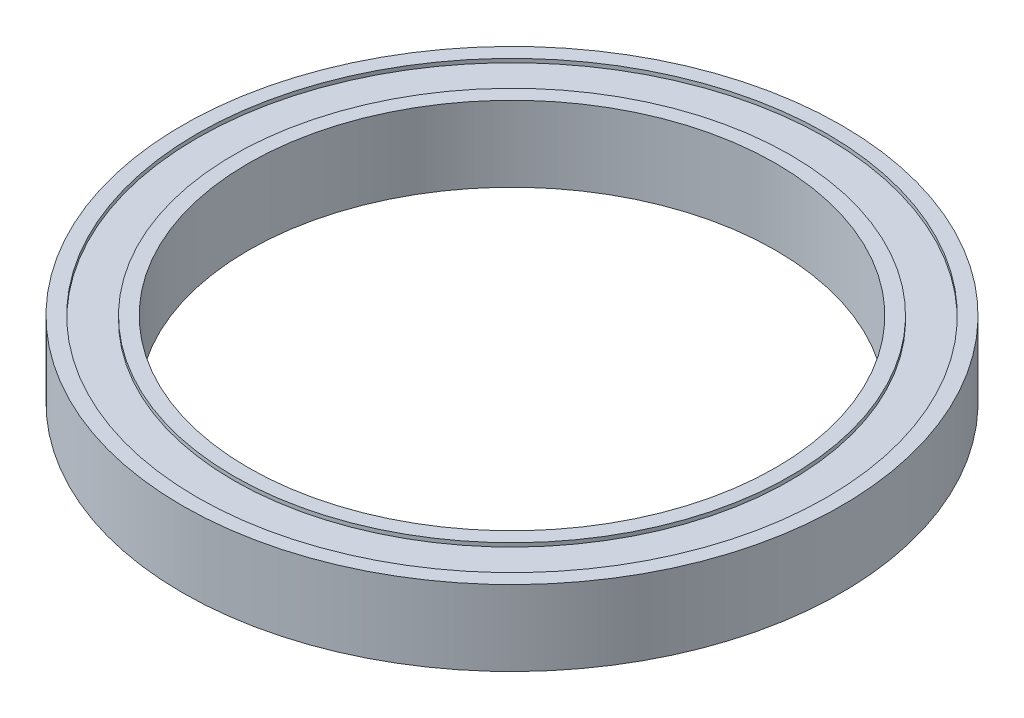
ISO-10303-21;
HEADER;
FILE_DESCRIPTION(('STEP AP214'),'2;1');
FILE_NAME('part.step','',(''),(''),'','','');
FILE_SCHEMA(('AUTOMOTIVE_DESIGN { 1 0 10303 214 1 1 1 1 }'));
ENDSEC;
DATA;
#1=APPLICATION_CONTEXT('core data for automotive mechanical design processes');
#2=APPLICATION_PROTOCOL_DEFINITION('international standard','automotive_design',2000,#1);
#3=PRODUCT_CONTEXT('',#1,'mechanical');
#4=PRODUCT('Part','Part','',(#3));
#5=PRODUCT_RELATED_PRODUCT_CATEGORY('part','',(#4));
#6=PRODUCT_DEFINITION_FORMATION('','',#4);
#7=PRODUCT_DEFINITION_CONTEXT('part definition',#1,'design');
#8=PRODUCT_DEFINITION('design','',#6,#7);
#9=PRODUCT_DEFINITION_SHAPE('','',#8);
#10=(LENGTH_UNIT() NAMED_UNIT(*) SI_UNIT(.MILLI.,.METRE.));
#11=(NAMED_UNIT(*) PLANE_ANGLE_UNIT() SI_UNIT($,.RADIAN.));
#12=(NAMED_UNIT(*) SI_UNIT($,.STERADIAN.) SOLID_ANGLE_UNIT());
#13=UNCERTAINTY_MEASURE_WITH_UNIT(LENGTH_MEASURE(1.E-05),#10,'distance_accuracy_value','');
#14=(GEOMETRIC_REPRESENTATION_CONTEXT(3) GLOBAL_UNCERTAINTY_ASSIGNED_CONTEXT((#13)) GLOBAL_UNIT_ASSIGNED_CONTEXT((#10,
#11,#12)) REPRESENTATION_CONTEXT('',''));
#15=CARTESIAN_POINT('',(0.,0.,0.));
#16=DIRECTION('',(0.,0.,1.));
#17=DIRECTION('',(1.,0.,0.));
#18=AXIS2_PLACEMENT_3D('',#15,#16,#17);
#19=CARTESIAN_POINT('',(14.,2.,0.));
#20=DIRECTION('',(0.,1.,0.));
#21=DIRECTION('',(0.,0.,1.));
#22=AXIS2_PLACEMENT_3D('',#19,#20,#21);
#23=PLANE('',#22);
#24=CARTESIAN_POINT('',(0.,2.,0.));
#25=DIRECTION('',(0.,-1.,0.));
#26=DIRECTION('',(0.,0.,-1.));
#27=AXIS2_PLACEMENT_3D('',#24,#25,#26);
#28=CIRCLE('',#27,14.);
#29=CARTESIAN_POINT('',(0.,2.,-14.));
#30=VERTEX_POINT('',#29);
#31=EDGE_CURVE('E81',#30,#30,#28,.T.);
#32=ORIENTED_EDGE('',*,*,#31,.T.);
#33=EDGE_LOOP('',(#32));
#34=FACE_BOUND('',#33,.T.);
#35=CARTESIAN_POINT('',(0.,2.,0.));
#36=DIRECTION('',(0.,-1.,0.));
#37=DIRECTION('',(0.,0.,-1.));
#38=AXIS2_PLACEMENT_3D('',#35,#36,#37);
#39=CIRCLE('',#38,14.7777777777778);
#40=CARTESIAN_POINT('',(0.,2.,-14.7777777777778));
#41=VERTEX_POINT('',#40);
#42=EDGE_CURVE('E10',#41,#41,#39,.T.);
#43=ORIENTED_EDGE('',*,*,#42,.F.);
#44=EDGE_LOOP('',(#43));
#45=FACE_BOUND('',#44,.T.);
#46=ADVANCED_FACE('F42',(#34,#45),#23,.T.);
#47=CARTESIAN_POINT('',(0.,0.,0.));
#48=DIRECTION('',(0.,-1.,0.));
#49=DIRECTION('',(0.,0.,-1.));
#50=AXIS2_PLACEMENT_3D('',#47,#48,#49);
#51=CYLINDRICAL_SURFACE('',#50,14.7777777777778);
#52=ORIENTED_EDGE('',*,*,#42,.T.);
#53=EDGE_LOOP('',(#52));
#54=FACE_BOUND('',#53,.T.);
#55=CARTESIAN_POINT('',(0.,1.8,0.));
#56=DIRECTION('',(0.,-1.,0.));
#57=DIRECTION('',(0.,0.,-1.));
#58=AXIS2_PLACEMENT_3D('',#55,#56,#57);
#59=CIRCLE('',#58,14.7777777777778);
#60=CARTESIAN_POINT('',(0.,1.8,-14.7777777777778));
#61=VERTEX_POINT('',#60);
#62=EDGE_CURVE('E49',#61,#61,#59,.T.);
#63=ORIENTED_EDGE('',*,*,#62,.F.);
#64=EDGE_LOOP('',(#63));
#65=FACE_BOUND('',#64,.T.);
#66=ADVANCED_FACE('F105',(#54,#65),#51,.T.);
#67=CARTESIAN_POINT('',(14.7777777777778,1.8,0.));
#68=DIRECTION('',(0.,1.,0.));
#69=DIRECTION('',(0.,0.,1.));
#70=AXIS2_PLACEMENT_3D('',#67,#68,#69);
#71=PLANE('',#70);
#72=ORIENTED_EDGE('',*,*,#62,.T.);
#73=EDGE_LOOP('',(#72));
#74=FACE_BOUND('',#73,.T.);
#75=CARTESIAN_POINT('',(0.,1.8,0.));
#76=DIRECTION('',(0.,-1.,0.));
#77=DIRECTION('',(0.,0.,-1.));
#78=AXIS2_PLACEMENT_3D('',#75,#76,#77);
#79=CIRCLE('',#78,16.7222222222222);
#80=CARTESIAN_POINT('',(0.,1.8,-16.7222222222222));
#81=VERTEX_POINT('',#80);
#82=EDGE_CURVE('E53',#81,#81,#79,.T.);
#83=ORIENTED_EDGE('',*,*,#82,.F.);
#84=EDGE_LOOP('',(#83));
#85=FACE_BOUND('',#84,.T.);
#86=ADVANCED_FACE('F106',(#74,#85),#71,.T.);
#87=CARTESIAN_POINT('',(0.,0.,0.));
#88=DIRECTION('',(0.,-1.,0.));
#89=DIRECTION('',(0.,0.,-1.));
#90=AXIS2_PLACEMENT_3D('',#87,#88,#89);
#91=CYLINDRICAL_SURFACE('',#90,16.7222222222222);
#92=ORIENTED_EDGE('',*,*,#82,.T.);
#93=EDGE_LOOP('',(#92));
#94=FACE_BOUND('',#93,.T.);
#95=CARTESIAN_POINT('',(0.,2.,0.));
#96=DIRECTION('',(0.,-1.,0.));
#97=DIRECTION('',(0.,0.,-1.));
#98=AXIS2_PLACEMENT_3D('',#95,#96,#97);
#99=CIRCLE('',#98,16.7222222222222);
#100=CARTESIAN_POINT('',(0.,2.,-16.7222222222222));
#101=VERTEX_POINT('',#100);
#102=EDGE_CURVE('E59',#101,#101,#99,.T.);
#103=ORIENTED_EDGE('',*,*,#102,.F.);
#104=EDGE_LOOP('',(#103));
#105=FACE_BOUND('',#104,.T.);
#106=ADVANCED_FACE('F112',(#94,#105),#91,.F.);
#107=CARTESIAN_POINT('',(16.7222222222222,2.,0.));
#108=DIRECTION('',(0.,1.,0.));
#109=DIRECTION('',(0.,0.,1.));
#110=AXIS2_PLACEMENT_3D('',#107,#108,#109);
#111=PLANE('',#110);
#112=ORIENTED_EDGE('',*,*,#102,.T.);
#113=EDGE_LOOP('',(#112));
#114=FACE_BOUND('',#113,.T.);
#115=CARTESIAN_POINT('',(0.,2.,0.));
#116=DIRECTION('',(0.,-1.,0.));
#117=DIRECTION('',(0.,0.,-1.));
#118=AXIS2_PLACEMENT_3D('',#115,#116,#117);
#119=CIRCLE('',#118,17.5);
#120=CARTESIAN_POINT('',(0.,2.,-17.5));
#121=VERTEX_POINT('',#120);
#122=EDGE_CURVE('E64',#121,#121,#119,.T.);
#123=ORIENTED_EDGE('',*,*,#122,.F.);
#124=EDGE_LOOP('',(#123));
#125=FACE_BOUND('',#124,.T.);
#126=ADVANCED_FACE('F117',(#114,#125),#111,.T.);
#127=CARTESIAN_POINT('',(0.,0.,0.));
#128=DIRECTION('',(0.,-1.,0.));
#129=DIRECTION('',(0.,0.,-1.));
#130=AXIS2_PLACEMENT_3D('',#127,#128,#129);
#131=CYLINDRICAL_SURFACE('',#130,17.5);
#132=ORIENTED_EDGE('',*,*,#122,.T.);
#133=EDGE_LOOP('',(#132));
#134=FACE_BOUND('',#133,.T.);
#135=CARTESIAN_POINT('',(0.,-2.,0.));
#136=DIRECTION('',(0.,-1.,0.));
#137=DIRECTION('',(0.,0.,-1.));
#138=AXIS2_PLACEMENT_3D('',#135,#136,#137);
#139=CIRCLE('',#138,17.5);
#140=CARTESIAN_POINT('',(0.,-2.,-17.5));
#141=VERTEX_POINT('',#140);
#142=EDGE_CURVE('E67',#141,#141,#139,.T.);
#143=ORIENTED_EDGE('',*,*,#142,.F.);
#144=EDGE_LOOP('',(#143));
#145=FACE_BOUND('',#144,.T.);
#146=ADVANCED_FACE('F122',(#134,#145),#131,.T.);
#147=CARTESIAN_POINT('',(16.7222222222222,-2.,0.));
#148=DIRECTION('',(0.,-1.,0.));
#149=DIRECTION('',(0.,0.,-1.));
#150=AXIS2_PLACEMENT_3D('',#147,#148,#149);
#151=PLANE('',#150);
#152=ORIENTED_EDGE('',*,*,#142,.T.);
#153=EDGE_LOOP('',(#152));
#154=FACE_BOUND('',#153,.T.);
#155=CARTESIAN_POINT('',(0.,-2.,0.));
#156=DIRECTION('',(0.,-1.,0.));
#157=DIRECTION('',(0.,0.,-1.));
#158=AXIS2_PLACEMENT_3D('',#155,#156,#157);
#159=CIRCLE('',#158,16.7222222222222);
#160=CARTESIAN_POINT('',(0.,-2.,-16.7222222222222));
#161=VERTEX_POINT('',#160);
#162=EDGE_CURVE('E66',#161,#161,#159,.T.);
#163=ORIENTED_EDGE('',*,*,#162,.F.);
#164=EDGE_LOOP('',(#163));
#165=FACE_BOUND('',#164,.T.);
#166=ADVANCED_FACE('F123',(#154,#165),#151,.T.);
#167=CARTESIAN_POINT('',(0.,0.,0.));
#168=DIRECTION('',(0.,-1.,0.));
#169=DIRECTION('',(0.,0.,-1.));
#170=AXIS2_PLACEMENT_3D('',#167,#168,#169);
#171=CYLINDRICAL_SURFACE('',#170,16.7222222222222);
#172=ORIENTED_EDGE('',*,*,#162,.T.);
#173=EDGE_LOOP('',(#172));
#174=FACE_BOUND('',#173,.T.);
#175=CARTESIAN_POINT('',(0.,-1.8,0.));
#176=DIRECTION('',(0.,-1.,0.));
#177=DIRECTION('',(0.,0.,-1.));
#178=AXIS2_PLACEMENT_3D('',#175,#176,#177);
#179=CIRCLE('',#178,16.7222222222222);
#180=CARTESIAN_POINT('',(0.,-1.8,-16.7222222222222));
#181=VERTEX_POINT('',#180);
#182=EDGE_CURVE('E75',#181,#181,#179,.T.);
#183=ORIENTED_EDGE('',*,*,#182,.F.);
#184=EDGE_LOOP('',(#183));
#185=FACE_BOUND('',#184,.T.);
#186=ADVANCED_FACE('F129',(#174,#185),#171,.F.);
#187=CARTESIAN_POINT('',(14.7777777777778,-1.8,0.));
#188=DIRECTION('',(0.,-1.,0.));
#189=DIRECTION('',(0.,0.,-1.));
#190=AXIS2_PLACEMENT_3D('',#187,#188,#189);
#191=PLANE('',#190);
#192=ORIENTED_EDGE('',*,*,#182,.T.);
#193=EDGE_LOOP('',(#192));
#194=FACE_BOUND('',#193,.T.);
#195=CARTESIAN_POINT('',(0.,-1.8,0.));
#196=DIRECTION('',(0.,-1.,0.));
#197=DIRECTION('',(0.,0.,-1.));
#198=AXIS2_PLACEMENT_3D('',#195,#196,#197);
#199=CIRCLE('',#198,14.7777777777778);
#200=CARTESIAN_POINT('',(0.,-1.8,-14.7777777777778));
#201=VERTEX_POINT('',#200);
#202=EDGE_CURVE('E73',#201,#201,#199,.T.);
#203=ORIENTED_EDGE('',*,*,#202,.F.);
#204=EDGE_LOOP('',(#203));
#205=FACE_BOUND('',#204,.T.);
#206=ADVANCED_FACE('F134',(#194,#205),#191,.T.);
#207=CARTESIAN_POINT('',(0.,0.,0.));
#208=DIRECTION('',(0.,-1.,0.));
#209=DIRECTION('',(0.,0.,-1.));
#210=AXIS2_PLACEMENT_3D('',#207,#208,#209);
#211=CYLINDRICAL_SURFACE('',#210,14.7777777777778);
#212=ORIENTED_EDGE('',*,*,#202,.T.);
#213=EDGE_LOOP('',(#212));
#214=FACE_BOUND('',#213,.T.);
#215=CARTESIAN_POINT('',(0.,-2.,0.));
#216=DIRECTION('',(0.,-1.,0.));
#217=DIRECTION('',(0.,0.,-1.));
#218=AXIS2_PLACEMENT_3D('',#215,#216,#217);
#219=CIRCLE('',#218,14.7777777777778);
#220=CARTESIAN_POINT('',(0.,-2.,-14.7777777777778));
#221=VERTEX_POINT('',#220);
#222=EDGE_CURVE('E79',#221,#221,#219,.T.);
#223=ORIENTED_EDGE('',*,*,#222,.F.);
#224=EDGE_LOOP('',(#223));
#225=FACE_BOUND('',#224,.T.);
#226=ADVANCED_FACE('F98',(#214,#225),#211,.T.);
#227=CARTESIAN_POINT('',(14.,-2.,0.));
#228=DIRECTION('',(0.,-1.,0.));
#229=DIRECTION('',(0.,0.,-1.));
#230=AXIS2_PLACEMENT_3D('',#227,#228,#229);
#231=PLANE('',#230);
#232=ORIENTED_EDGE('',*,*,#222,.T.);
#233=EDGE_LOOP('',(#232));
#234=FACE_BOUND('',#233,.T.);
#235=CARTESIAN_POINT('',(0.,-2.,0.));
#236=DIRECTION('',(0.,-1.,0.));
#237=DIRECTION('',(0.,0.,-1.));
#238=AXIS2_PLACEMENT_3D('',#235,#236,#237);
#239=CIRCLE('',#238,14.);
#240=CARTESIAN_POINT('',(0.,-2.,-14.));
#241=VERTEX_POINT('',#240);
#242=EDGE_CURVE('E82',#241,#241,#239,.T.);
#243=ORIENTED_EDGE('',*,*,#242,.F.);
#244=EDGE_LOOP('',(#243));
#245=FACE_BOUND('',#244,.T.);
#246=ADVANCED_FACE('F95',(#234,#245),#231,.T.);
#247=CARTESIAN_POINT('',(0.,0.,0.));
#248=DIRECTION('',(0.,-1.,0.));
#249=DIRECTION('',(0.,0.,-1.));
#250=AXIS2_PLACEMENT_3D('',#247,#248,#249);
#251=CYLINDRICAL_SURFACE('',#250,14.);
#252=ORIENTED_EDGE('',*,*,#242,.T.);
#253=EDGE_LOOP('',(#252));
#254=FACE_BOUND('',#253,.T.);
#255=ORIENTED_EDGE('',*,*,#31,.F.);
#256=EDGE_LOOP('',(#255));
#257=FACE_BOUND('',#256,.T.);
#258=ADVANCED_FACE('F89',(#254,#257),#251,.F.);
#259=CLOSED_SHELL('',(#46,#66,#86,#106,#126,#146,#166,#186,#206,#226,#246,#258));
#260=MANIFOLD_SOLID_BREP('B2',#259);
#261=ADVANCED_BREP_SHAPE_REPRESENTATION('',(#18,#260),#14);
#262=SHAPE_DEFINITION_REPRESENTATION(#9,#261);
ENDSEC;
END-ISO-10303-21;
